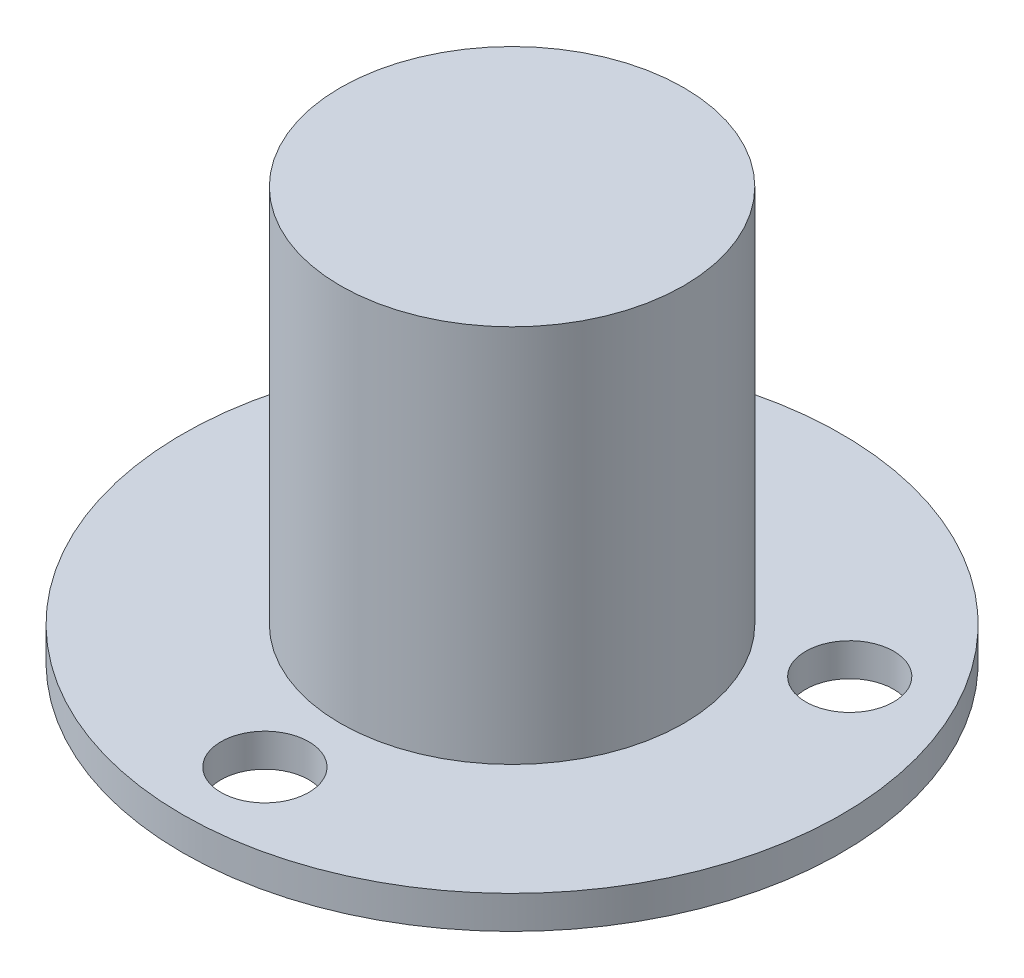
ISO-10303-21;
HEADER;
FILE_DESCRIPTION(('STEP AP214'),'2;1');
FILE_NAME('part.step','',(''),(''),'','','');
FILE_SCHEMA(('AUTOMOTIVE_DESIGN { 1 0 10303 214 1 1 1 1 }'));
ENDSEC;
DATA;
#1=APPLICATION_CONTEXT('core data for automotive mechanical design processes');
#2=APPLICATION_PROTOCOL_DEFINITION('international standard','automotive_design',2000,#1);
#3=PRODUCT_CONTEXT('',#1,'mechanical');
#4=PRODUCT('Part','Part','',(#3));
#5=PRODUCT_RELATED_PRODUCT_CATEGORY('part','',(#4));
#6=PRODUCT_DEFINITION_FORMATION('','',#4);
#7=PRODUCT_DEFINITION_CONTEXT('part definition',#1,'design');
#8=PRODUCT_DEFINITION('design','',#6,#7);
#9=PRODUCT_DEFINITION_SHAPE('','',#8);
#10=(LENGTH_UNIT() NAMED_UNIT(*) SI_UNIT(.MILLI.,.METRE.));
#11=(NAMED_UNIT(*) PLANE_ANGLE_UNIT() SI_UNIT($,.RADIAN.));
#12=(NAMED_UNIT(*) SI_UNIT($,.STERADIAN.) SOLID_ANGLE_UNIT());
#13=UNCERTAINTY_MEASURE_WITH_UNIT(LENGTH_MEASURE(1.E-05),#10,'distance_accuracy_value','');
#14=(GEOMETRIC_REPRESENTATION_CONTEXT(3) GLOBAL_UNCERTAINTY_ASSIGNED_CONTEXT((#13)) GLOBAL_UNIT_ASSIGNED_CONTEXT((#10,
#11,#12)) REPRESENTATION_CONTEXT('',''));
#15=CARTESIAN_POINT('',(0.,0.,0.));
#16=DIRECTION('',(0.,0.,1.));
#17=DIRECTION('',(1.,0.,0.));
#18=AXIS2_PLACEMENT_3D('',#15,#16,#17);
#19=CARTESIAN_POINT('',(0.,1.2,0.));
#20=DIRECTION('',(0.,-1.,0.));
#21=DIRECTION('',(0.,0.,-1.));
#22=AXIS2_PLACEMENT_3D('',#19,#20,#21);
#23=CYLINDRICAL_SURFACE('',#22,12.);
#24=CARTESIAN_POINT('',(0.,1.2,0.));
#25=DIRECTION('',(0.,1.,0.));
#26=DIRECTION('',(0.,0.,1.));
#27=AXIS2_PLACEMENT_3D('',#24,#25,#26);
#28=CIRCLE('',#27,12.);
#29=CARTESIAN_POINT('',(0.,1.2,12.));
#30=VERTEX_POINT('',#29);
#31=EDGE_CURVE('E63',#30,#30,#28,.T.);
#32=ORIENTED_EDGE('',*,*,#31,.F.);
#33=EDGE_LOOP('',(#32));
#34=FACE_BOUND('',#33,.T.);
#35=CARTESIAN_POINT('',(0.,0.,0.));
#36=DIRECTION('',(0.,1.,0.));
#37=DIRECTION('',(0.,0.,1.));
#38=AXIS2_PLACEMENT_3D('',#35,#36,#37);
#39=CIRCLE('',#38,12.);
#40=CARTESIAN_POINT('',(0.,0.,12.));
#41=VERTEX_POINT('',#40);
#42=EDGE_CURVE('E52',#41,#41,#39,.T.);
#43=ORIENTED_EDGE('',*,*,#42,.T.);
#44=EDGE_LOOP('',(#43));
#45=FACE_BOUND('',#44,.T.);
#46=ADVANCED_FACE('F49',(#34,#45),#23,.T.);
#47=CARTESIAN_POINT('',(0.,1.2,0.));
#48=DIRECTION('',(0.,1.,0.));
#49=DIRECTION('',(0.,0.,1.));
#50=AXIS2_PLACEMENT_3D('',#47,#48,#49);
#51=PLANE('',#50);
#52=CARTESIAN_POINT('',(0.,1.2,9.));
#53=DIRECTION('',(0.,1.,0.));
#54=DIRECTION('',(0.,0.,1.));
#55=AXIS2_PLACEMENT_3D('',#52,#53,#54);
#56=CIRCLE('',#55,1.6);
#57=CARTESIAN_POINT('',(0.,1.2,7.4));
#58=VERTEX_POINT('',#57);
#59=EDGE_CURVE('E184',#58,#58,#56,.F.);
#60=ORIENTED_EDGE('',*,*,#59,.T.);
#61=EDGE_LOOP('',(#60));
#62=FACE_BOUND('',#61,.T.);
#63=CARTESIAN_POINT('',(7.79422863406033,1.2,-4.49999999999978));
#64=DIRECTION('',(0.,1.,0.));
#65=DIRECTION('',(0.,0.,1.));
#66=AXIS2_PLACEMENT_3D('',#63,#64,#65);
#67=CIRCLE('',#66,1.60000000000034);
#68=CARTESIAN_POINT('',(7.79422863406033,1.2,-6.10000000000012));
#69=VERTEX_POINT('',#68);
#70=EDGE_CURVE('E193',#69,#69,#67,.F.);
#71=ORIENTED_EDGE('',*,*,#70,.T.);
#72=EDGE_LOOP('',(#71));
#73=FACE_BOUND('',#72,.T.);
#74=CARTESIAN_POINT('',(-7.79422863405956,1.2,-4.50000000000022));
#75=DIRECTION('',(0.,1.,0.));
#76=DIRECTION('',(0.,0.,1.));
#77=AXIS2_PLACEMENT_3D('',#74,#75,#76);
#78=CIRCLE('',#77,1.60000000000051);
#79=CARTESIAN_POINT('',(-7.79422863405956,1.2,-6.10000000000074));
#80=VERTEX_POINT('',#79);
#81=EDGE_CURVE('E201',#80,#80,#78,.F.);
#82=ORIENTED_EDGE('',*,*,#81,.T.);
#83=EDGE_LOOP('',(#82));
#84=FACE_BOUND('',#83,.T.);
#85=CARTESIAN_POINT('',(0.,1.2,0.));
#86=DIRECTION('',(0.,1.,0.));
#87=DIRECTION('',(0.,0.,1.));
#88=AXIS2_PLACEMENT_3D('',#85,#86,#87);
#89=CIRCLE('',#88,6.25);
#90=CARTESIAN_POINT('',(0.,1.2,-6.25));
#91=VERTEX_POINT('',#90);
#92=EDGE_CURVE('E57',#91,#91,#89,.T.);
#93=ORIENTED_EDGE('',*,*,#92,.F.);
#94=EDGE_LOOP('',(#93));
#95=FACE_BOUND('',#94,.T.);
#96=ORIENTED_EDGE('',*,*,#31,.T.);
#97=EDGE_LOOP('',(#96));
#98=FACE_BOUND('',#97,.T.);
#99=ADVANCED_FACE('F84',(#62,#73,#84,#95,#98),#51,.T.);
#100=CARTESIAN_POINT('',(0.,0.,0.));
#101=DIRECTION('',(0.,1.,0.));
#102=DIRECTION('',(0.,0.,1.));
#103=AXIS2_PLACEMENT_3D('',#100,#101,#102);
#104=PLANE('',#103);
#105=CARTESIAN_POINT('',(0.,0.,9.));
#106=DIRECTION('',(0.,-1.,0.));
#107=DIRECTION('',(0.,0.,-1.));
#108=AXIS2_PLACEMENT_3D('',#105,#106,#107);
#109=CIRCLE('',#108,1.6);
#110=CARTESIAN_POINT('',(0.,0.,7.4));
#111=VERTEX_POINT('',#110);
#112=EDGE_CURVE('E181',#111,#111,#109,.T.);
#113=ORIENTED_EDGE('',*,*,#112,.F.);
#114=EDGE_LOOP('',(#113));
#115=FACE_BOUND('',#114,.T.);
#116=CARTESIAN_POINT('',(7.79422863406033,0.,-4.49999999999978));
#117=DIRECTION('',(0.,-1.,0.));
#118=DIRECTION('',(0.,0.,-1.));
#119=AXIS2_PLACEMENT_3D('',#116,#117,#118);
#120=CIRCLE('',#119,1.60000000000034);
#121=CARTESIAN_POINT('',(7.79422863406033,0.,-6.10000000000012));
#122=VERTEX_POINT('',#121);
#123=EDGE_CURVE('E190',#122,#122,#120,.T.);
#124=ORIENTED_EDGE('',*,*,#123,.F.);
#125=EDGE_LOOP('',(#124));
#126=FACE_BOUND('',#125,.T.);
#127=CARTESIAN_POINT('',(-7.79422863405956,0.,-4.50000000000022));
#128=DIRECTION('',(0.,-1.,0.));
#129=DIRECTION('',(0.,0.,-1.));
#130=AXIS2_PLACEMENT_3D('',#127,#128,#129);
#131=CIRCLE('',#130,1.60000000000051);
#132=CARTESIAN_POINT('',(-7.79422863405956,0.,-6.10000000000074));
#133=VERTEX_POINT('',#132);
#134=EDGE_CURVE('E197',#133,#133,#131,.T.);
#135=ORIENTED_EDGE('',*,*,#134,.F.);
#136=EDGE_LOOP('',(#135));
#137=FACE_BOUND('',#136,.T.);
#138=CARTESIAN_POINT('',(0.,0.,0.));
#139=DIRECTION('',(0.,-1.,0.));
#140=DIRECTION('',(0.,0.,-1.));
#141=AXIS2_PLACEMENT_3D('',#138,#139,#140);
#142=CIRCLE('',#141,2.5);
#143=CARTESIAN_POINT('',(0.,0.,-2.5));
#144=VERTEX_POINT('',#143);
#145=EDGE_CURVE('E10',#144,#144,#142,.T.);
#146=ORIENTED_EDGE('',*,*,#145,.F.);
#147=EDGE_LOOP('',(#146));
#148=FACE_BOUND('',#147,.T.);
#149=ORIENTED_EDGE('',*,*,#42,.F.);
#150=EDGE_LOOP('',(#149));
#151=FACE_BOUND('',#150,.T.);
#152=ADVANCED_FACE('F81',(#115,#126,#137,#148,#151),#104,.F.);
#153=CARTESIAN_POINT('',(0.,15.,0.));
#154=DIRECTION('',(0.,-1.,0.));
#155=DIRECTION('',(0.,0.,-1.));
#156=AXIS2_PLACEMENT_3D('',#153,#154,#155);
#157=CYLINDRICAL_SURFACE('',#156,6.25);
#158=CARTESIAN_POINT('',(0.,15.,0.));
#159=DIRECTION('',(0.,1.,0.));
#160=DIRECTION('',(0.,0.,1.));
#161=AXIS2_PLACEMENT_3D('',#158,#159,#160);
#162=CIRCLE('',#161,6.25);
#163=CARTESIAN_POINT('',(0.,15.,-6.25));
#164=VERTEX_POINT('',#163);
#165=EDGE_CURVE('E69',#164,#164,#162,.T.);
#166=CARTESIAN_POINT('',(0.,15.,-6.25));
#167=CARTESIAN_POINT('',(0.,14.85625,-6.25));
#168=CARTESIAN_POINT('',(0.,14.7125,-6.25));
#169=CARTESIAN_POINT('',(0.,14.425,-6.25));
#170=CARTESIAN_POINT('',(0.,14.28125,-6.25));
#171=CARTESIAN_POINT('',(0.,13.99375,-6.25));
#172=CARTESIAN_POINT('',(0.,13.85,-6.25));
#173=CARTESIAN_POINT('',(0.,13.5625,-6.25));
#174=CARTESIAN_POINT('',(0.,13.41875,-6.25));
#175=CARTESIAN_POINT('',(0.,13.13125,-6.25));
#176=CARTESIAN_POINT('',(0.,12.9875,-6.25));
#177=CARTESIAN_POINT('',(0.,12.7,-6.25));
#178=CARTESIAN_POINT('',(0.,12.55625,-6.25));
#179=CARTESIAN_POINT('',(0.,12.26875,-6.25));
#180=CARTESIAN_POINT('',(0.,12.125,-6.25));
#181=CARTESIAN_POINT('',(0.,11.8375,-6.25));
#182=CARTESIAN_POINT('',(0.,11.69375,-6.25));
#183=CARTESIAN_POINT('',(0.,11.40625,-6.25));
#184=CARTESIAN_POINT('',(0.,11.2625,-6.25));
#185=CARTESIAN_POINT('',(0.,10.975,-6.25));
#186=CARTESIAN_POINT('',(0.,10.83125,-6.25));
#187=CARTESIAN_POINT('',(0.,10.54375,-6.25));
#188=CARTESIAN_POINT('',(0.,10.4,-6.25));
#189=CARTESIAN_POINT('',(0.,10.1125,-6.25));
#190=CARTESIAN_POINT('',(0.,9.96875,-6.25));
#191=CARTESIAN_POINT('',(0.,9.68125,-6.25));
#192=CARTESIAN_POINT('',(0.,9.5375,-6.25));
#193=CARTESIAN_POINT('',(0.,9.25,-6.25));
#194=CARTESIAN_POINT('',(0.,9.10625,-6.25));
#195=CARTESIAN_POINT('',(0.,8.81875,-6.25));
#196=CARTESIAN_POINT('',(0.,8.675,-6.25));
#197=CARTESIAN_POINT('',(0.,8.3875,-6.25));
#198=CARTESIAN_POINT('',(0.,8.24375,-6.25));
#199=CARTESIAN_POINT('',(0.,7.95625,-6.25));
#200=CARTESIAN_POINT('',(0.,7.8125,-6.25));
#201=CARTESIAN_POINT('',(0.,7.525,-6.25));
#202=CARTESIAN_POINT('',(0.,7.38125,-6.25));
#203=CARTESIAN_POINT('',(0.,7.09375,-6.25));
#204=CARTESIAN_POINT('',(0.,6.95,-6.25));
#205=CARTESIAN_POINT('',(0.,6.6625,-6.25));
#206=CARTESIAN_POINT('',(0.,6.51875,-6.25));
#207=CARTESIAN_POINT('',(0.,6.23125,-6.25));
#208=CARTESIAN_POINT('',(0.,6.0875,-6.25));
#209=CARTESIAN_POINT('',(0.,5.8,-6.25));
#210=CARTESIAN_POINT('',(0.,5.65625,-6.25));
#211=CARTESIAN_POINT('',(0.,5.36875,-6.25));
#212=CARTESIAN_POINT('',(0.,5.225,-6.25));
#213=CARTESIAN_POINT('',(0.,4.9375,-6.25));
#214=CARTESIAN_POINT('',(0.,4.79375,-6.25));
#215=CARTESIAN_POINT('',(0.,4.50625,-6.25));
#216=CARTESIAN_POINT('',(0.,4.3625,-6.25));
#217=CARTESIAN_POINT('',(0.,4.075,-6.25));
#218=CARTESIAN_POINT('',(0.,3.93125,-6.25));
#219=CARTESIAN_POINT('',(0.,3.64375,-6.25));
#220=CARTESIAN_POINT('',(0.,3.5,-6.25));
#221=CARTESIAN_POINT('',(0.,3.2125,-6.25));
#222=CARTESIAN_POINT('',(0.,3.06875,-6.25));
#223=CARTESIAN_POINT('',(0.,2.78125,-6.25));
#224=CARTESIAN_POINT('',(0.,2.6375,-6.25));
#225=CARTESIAN_POINT('',(0.,2.35,-6.25));
#226=CARTESIAN_POINT('',(0.,2.20625,-6.25));
#227=CARTESIAN_POINT('',(0.,1.91875,-6.25));
#228=CARTESIAN_POINT('',(0.,1.775,-6.25));
#229=CARTESIAN_POINT('',(0.,1.4875,-6.25));
#230=CARTESIAN_POINT('',(0.,1.34375,-6.25));
#231=CARTESIAN_POINT('',(0.,1.2,-6.25));
#232=B_SPLINE_CURVE_WITH_KNOTS('',3,(#166,#167,#168,#169,#170,#171,#172,#173,#174,#175,#176,
#177,#178,#179,#180,#181,#182,#183,#184,#185,#186,#187,#188,#189,#190,#191,#192,#193,#194,#195,
#196,#197,#198,#199,#200,#201,#202,#203,#204,#205,#206,#207,#208,#209,#210,#211,#212,#213,#214,
#215,#216,#217,#218,#219,#220,#221,#222,#223,#224,#225,#226,#227,#228,#229,#230,#231),
.UNSPECIFIED.,.F.,.F.,(4,2,2,2,2,2,2,2,2,2,2,2,2,2,2,2,2,2,2,2,2,2,2,2,2,2,2,2,2,2,2,2,4),(0.,
0.431250000000001,0.8625,1.29375,1.725,2.15625,2.5875,3.01875,3.45,3.88125,4.3125,4.74375,5.175,
5.60625,6.0375,6.46875,6.9,7.33125,7.7625,8.19375,8.625,9.05625,9.4875,9.91875,10.35,10.78125,
11.2125,11.64375,12.075,12.50625,12.9375,13.36875,13.8),.UNSPECIFIED.);
#233=EDGE_CURVE('BSEAM83',#164,#91,#232,.T.);
#234=ORIENTED_EDGE('',*,*,#165,.F.);
#235=ORIENTED_EDGE('',*,*,#92,.T.);
#236=ORIENTED_EDGE('',*,*,#233,.T.);
#237=ORIENTED_EDGE('',*,*,#233,.F.);
#238=EDGE_LOOP('',(#234,#236,#235,#237));
#239=FACE_BOUND('',#238,.T.);
#240=ADVANCED_FACE('F83',(#239),#157,.T.);
#241=CARTESIAN_POINT('',(0.,15.,0.));
#242=DIRECTION('',(0.,1.,0.));
#243=DIRECTION('',(0.,0.,1.));
#244=AXIS2_PLACEMENT_3D('',#241,#242,#243);
#245=PLANE('',#244);
#246=ORIENTED_EDGE('',*,*,#165,.T.);
#247=EDGE_LOOP('',(#246));
#248=FACE_BOUND('',#247,.T.);
#249=ADVANCED_FACE('F91',(#248),#245,.T.);
#250=CARTESIAN_POINT('',(0.,-1.5,0.));
#251=DIRECTION('',(0.,1.,0.));
#252=DIRECTION('',(0.,0.,1.));
#253=AXIS2_PLACEMENT_3D('',#250,#251,#252);
#254=CYLINDRICAL_SURFACE('',#253,2.5);
#255=CARTESIAN_POINT('',(0.,-1.5,0.));
#256=DIRECTION('',(0.,-1.,0.));
#257=DIRECTION('',(0.,0.,-1.));
#258=AXIS2_PLACEMENT_3D('',#255,#256,#257);
#259=CIRCLE('',#258,2.5);
#260=CARTESIAN_POINT('',(0.,-1.5,-2.5));
#261=VERTEX_POINT('',#260);
#262=EDGE_CURVE('E67',#261,#261,#259,.T.);
#263=ORIENTED_EDGE('',*,*,#262,.F.);
#264=EDGE_LOOP('',(#263));
#265=FACE_BOUND('',#264,.T.);
#266=ORIENTED_EDGE('',*,*,#145,.T.);
#267=EDGE_LOOP('',(#266));
#268=FACE_BOUND('',#267,.T.);
#269=ADVANCED_FACE('F115',(#265,#268),#254,.T.);
#270=CARTESIAN_POINT('',(0.,-1.5,0.));
#271=DIRECTION('',(0.,-1.,0.));
#272=DIRECTION('',(0.,0.,-1.));
#273=AXIS2_PLACEMENT_3D('',#270,#271,#272);
#274=PLANE('',#273);
#275=ORIENTED_EDGE('',*,*,#262,.T.);
#276=EDGE_LOOP('',(#275));
#277=FACE_BOUND('',#276,.T.);
#278=ADVANCED_FACE('F124',(#277),#274,.T.);
#279=CARTESIAN_POINT('',(-7.79422863405956,5.72548339959535,-4.50000000000022));
#280=DIRECTION('',(0.,-1.,0.));
#281=DIRECTION('',(0.,0.,-1.));
#282=AXIS2_PLACEMENT_3D('',#279,#280,#281);
#283=CYLINDRICAL_SURFACE('',#282,1.60000000000051);
#284=CARTESIAN_POINT('',(-7.79422863405956,0.,-6.10000000000074));
#285=CARTESIAN_POINT('',(-7.79422863405956,0.0125000000000009,-6.10000000000074));
#286=CARTESIAN_POINT('',(-7.79422863405956,0.025000000000001,-6.10000000000074));
#287=CARTESIAN_POINT('',(-7.79422863405956,0.0500000000000008,-6.10000000000074));
#288=CARTESIAN_POINT('',(-7.79422863405956,0.0625000000000006,-6.10000000000074));
#289=CARTESIAN_POINT('',(-7.79422863405956,0.0875000000000005,-6.10000000000074));
#290=CARTESIAN_POINT('',(-7.79422863405956,0.100000000000001,-6.10000000000074));
#291=CARTESIAN_POINT('',(-7.79422863405956,0.125000000000001,-6.10000000000074));
#292=CARTESIAN_POINT('',(-7.79422863405956,0.137500000000001,-6.10000000000074));
#293=CARTESIAN_POINT('',(-7.79422863405956,0.162500000000001,-6.10000000000074));
#294=CARTESIAN_POINT('',(-7.79422863405956,0.175,-6.10000000000074));
#295=CARTESIAN_POINT('',(-7.79422863405956,0.2,-6.10000000000074));
#296=CARTESIAN_POINT('',(-7.79422863405956,0.2125,-6.10000000000074));
#297=CARTESIAN_POINT('',(-7.79422863405956,0.2375,-6.10000000000074));
#298=CARTESIAN_POINT('',(-7.79422863405956,0.25,-6.10000000000074));
#299=CARTESIAN_POINT('',(-7.79422863405956,0.275000000000001,-6.10000000000074));
#300=CARTESIAN_POINT('',(-7.79422863405956,0.287500000000001,-6.10000000000074));
#301=CARTESIAN_POINT('',(-7.79422863405956,0.312500000000001,-6.10000000000074));
#302=CARTESIAN_POINT('',(-7.79422863405956,0.325,-6.10000000000074));
#303=CARTESIAN_POINT('',(-7.79422863405956,0.35,-6.10000000000074));
#304=CARTESIAN_POINT('',(-7.79422863405956,0.3625,-6.10000000000074));
#305=CARTESIAN_POINT('',(-7.79422863405956,0.3875,-6.10000000000074));
#306=CARTESIAN_POINT('',(-7.79422863405956,0.4,-6.10000000000074));
#307=CARTESIAN_POINT('',(-7.79422863405956,0.425,-6.10000000000074));
#308=CARTESIAN_POINT('',(-7.79422863405956,0.4375,-6.10000000000074));
#309=CARTESIAN_POINT('',(-7.79422863405956,0.4625,-6.10000000000074));
#310=CARTESIAN_POINT('',(-7.79422863405956,0.475,-6.10000000000074));
#311=CARTESIAN_POINT('',(-7.79422863405956,0.5,-6.10000000000074));
#312=CARTESIAN_POINT('',(-7.79422863405956,0.5125,-6.10000000000074));
#313=CARTESIAN_POINT('',(-7.79422863405956,0.5375,-6.10000000000074));
#314=CARTESIAN_POINT('',(-7.79422863405956,0.55,-6.10000000000074));
#315=CARTESIAN_POINT('',(-7.79422863405956,0.575,-6.10000000000074));
#316=CARTESIAN_POINT('',(-7.79422863405956,0.5875,-6.10000000000074));
#317=CARTESIAN_POINT('',(-7.79422863405956,0.6125,-6.10000000000074));
#318=CARTESIAN_POINT('',(-7.79422863405956,0.625,-6.10000000000074));
#319=CARTESIAN_POINT('',(-7.79422863405956,0.65,-6.10000000000074));
#320=CARTESIAN_POINT('',(-7.79422863405956,0.6625,-6.10000000000074));
#321=CARTESIAN_POINT('',(-7.79422863405956,0.687499999999999,-6.10000000000074));
#322=CARTESIAN_POINT('',(-7.79422863405956,0.7,-6.10000000000074));
#323=CARTESIAN_POINT('',(-7.79422863405956,0.725,-6.10000000000074));
#324=CARTESIAN_POINT('',(-7.79422863405956,0.7375,-6.10000000000074));
#325=CARTESIAN_POINT('',(-7.79422863405956,0.7625,-6.10000000000074));
#326=CARTESIAN_POINT('',(-7.79422863405956,0.774999999999999,-6.10000000000074));
#327=CARTESIAN_POINT('',(-7.79422863405956,0.799999999999999,-6.10000000000074));
#328=CARTESIAN_POINT('',(-7.79422863405956,0.812499999999999,-6.10000000000074));
#329=CARTESIAN_POINT('',(-7.79422863405956,0.837499999999999,-6.10000000000074));
#330=CARTESIAN_POINT('',(-7.79422863405956,0.85,-6.10000000000074));
#331=CARTESIAN_POINT('',(-7.79422863405956,0.874999999999999,-6.10000000000074));
#332=CARTESIAN_POINT('',(-7.79422863405956,0.887499999999999,-6.10000000000074));
#333=CARTESIAN_POINT('',(-7.79422863405956,0.912499999999999,-6.10000000000074));
#334=CARTESIAN_POINT('',(-7.79422863405956,0.924999999999999,-6.10000000000074));
#335=CARTESIAN_POINT('',(-7.79422863405956,0.949999999999999,-6.10000000000074));
#336=CARTESIAN_POINT('',(-7.79422863405956,0.962499999999999,-6.10000000000074));
#337=CARTESIAN_POINT('',(-7.79422863405956,0.987499999999999,-6.10000000000074));
#338=CARTESIAN_POINT('',(-7.79422863405956,0.999999999999999,-6.10000000000074));
#339=CARTESIAN_POINT('',(-7.79422863405956,1.025,-6.10000000000074));
#340=CARTESIAN_POINT('',(-7.79422863405956,1.0375,-6.10000000000074));
#341=CARTESIAN_POINT('',(-7.79422863405956,1.0625,-6.10000000000074));
#342=CARTESIAN_POINT('',(-7.79422863405956,1.075,-6.10000000000074));
#343=CARTESIAN_POINT('',(-7.79422863405956,1.1,-6.10000000000074));
#344=CARTESIAN_POINT('',(-7.79422863405956,1.1125,-6.10000000000074));
#345=CARTESIAN_POINT('',(-7.79422863405956,1.1375,-6.10000000000074));
#346=CARTESIAN_POINT('',(-7.79422863405956,1.15,-6.10000000000074));
#347=CARTESIAN_POINT('',(-7.79422863405956,1.175,-6.10000000000074));
#348=CARTESIAN_POINT('',(-7.79422863405956,1.1875,-6.10000000000074));
#349=CARTESIAN_POINT('',(-7.79422863405956,1.2,-6.10000000000074));
#350=B_SPLINE_CURVE_WITH_KNOTS('',3,(#284,#285,#286,#287,#288,#289,#290,#291,#292,#293,#294,
#295,#296,#297,#298,#299,#300,#301,#302,#303,#304,#305,#306,#307,#308,#309,#310,#311,#312,#313,
#314,#315,#316,#317,#318,#319,#320,#321,#322,#323,#324,#325,#326,#327,#328,#329,#330,#331,#332,
#333,#334,#335,#336,#337,#338,#339,#340,#341,#342,#343,#344,#345,#346,#347,#348,#349),
.UNSPECIFIED.,.F.,.F.,(4,2,2,2,2,2,2,2,2,2,2,2,2,2,2,2,2,2,2,2,2,2,2,2,2,2,2,2,2,2,2,2,4),(0.,
0.0375000000000002,0.0749999999999995,0.1125,0.15,0.187499999999999,0.225,0.2625,0.3,
0.337499999999999,0.374999999999999,0.4125,0.449999999999999,0.487499999999999,
0.524999999999999,0.562499999999999,0.599999999999999,0.637499999999999,0.674999999999998,
0.712499999999999,0.749999999999999,0.787499999999998,0.824999999999999,0.862499999999999,
0.899999999999998,0.937499999999998,0.974999999999998,1.0125,1.05,1.0875,1.125,1.1625,1.2),.UNSPECIFIED.);
#351=EDGE_CURVE('BSEAM132',#133,#80,#350,.T.);
#352=ORIENTED_EDGE('',*,*,#134,.T.);
#353=ORIENTED_EDGE('',*,*,#81,.F.);
#354=ORIENTED_EDGE('',*,*,#351,.T.);
#355=ORIENTED_EDGE('',*,*,#351,.F.);
#356=EDGE_LOOP('',(#352,#354,#353,#355));
#357=FACE_BOUND('',#356,.T.);
#358=ADVANCED_FACE('F132',(#357),#283,.F.);
#359=CARTESIAN_POINT('',(7.79422863406033,5.72548339959535,-4.49999999999978));
#360=DIRECTION('',(0.,-1.,0.));
#361=DIRECTION('',(0.,0.,-1.));
#362=AXIS2_PLACEMENT_3D('',#359,#360,#361);
#363=CYLINDRICAL_SURFACE('',#362,1.60000000000034);
#364=CARTESIAN_POINT('',(7.79422863406033,0.,-6.10000000000012));
#365=CARTESIAN_POINT('',(7.79422863406033,0.0125000000000009,-6.10000000000012));
#366=CARTESIAN_POINT('',(7.79422863406033,0.025000000000001,-6.10000000000012));
#367=CARTESIAN_POINT('',(7.79422863406033,0.0500000000000008,-6.10000000000012));
#368=CARTESIAN_POINT('',(7.79422863406033,0.0625000000000006,-6.10000000000012));
#369=CARTESIAN_POINT('',(7.79422863406033,0.0875000000000005,-6.10000000000012));
#370=CARTESIAN_POINT('',(7.79422863406033,0.100000000000001,-6.10000000000012));
#371=CARTESIAN_POINT('',(7.79422863406033,0.125000000000001,-6.10000000000012));
#372=CARTESIAN_POINT('',(7.79422863406033,0.137500000000001,-6.10000000000012));
#373=CARTESIAN_POINT('',(7.79422863406033,0.162500000000001,-6.10000000000012));
#374=CARTESIAN_POINT('',(7.79422863406033,0.175,-6.10000000000012));
#375=CARTESIAN_POINT('',(7.79422863406033,0.2,-6.10000000000012));
#376=CARTESIAN_POINT('',(7.79422863406033,0.2125,-6.10000000000012));
#377=CARTESIAN_POINT('',(7.79422863406033,0.2375,-6.10000000000012));
#378=CARTESIAN_POINT('',(7.79422863406033,0.25,-6.10000000000012));
#379=CARTESIAN_POINT('',(7.79422863406033,0.275000000000001,-6.10000000000012));
#380=CARTESIAN_POINT('',(7.79422863406033,0.287500000000001,-6.10000000000012));
#381=CARTESIAN_POINT('',(7.79422863406033,0.312500000000001,-6.10000000000012));
#382=CARTESIAN_POINT('',(7.79422863406033,0.325,-6.10000000000012));
#383=CARTESIAN_POINT('',(7.79422863406033,0.35,-6.10000000000012));
#384=CARTESIAN_POINT('',(7.79422863406033,0.3625,-6.10000000000012));
#385=CARTESIAN_POINT('',(7.79422863406033,0.3875,-6.10000000000012));
#386=CARTESIAN_POINT('',(7.79422863406033,0.4,-6.10000000000012));
#387=CARTESIAN_POINT('',(7.79422863406033,0.425,-6.10000000000012));
#388=CARTESIAN_POINT('',(7.79422863406033,0.4375,-6.10000000000012));
#389=CARTESIAN_POINT('',(7.79422863406033,0.4625,-6.10000000000012));
#390=CARTESIAN_POINT('',(7.79422863406033,0.475,-6.10000000000012));
#391=CARTESIAN_POINT('',(7.79422863406033,0.5,-6.10000000000012));
#392=CARTESIAN_POINT('',(7.79422863406033,0.5125,-6.10000000000012));
#393=CARTESIAN_POINT('',(7.79422863406033,0.5375,-6.10000000000012));
#394=CARTESIAN_POINT('',(7.79422863406033,0.55,-6.10000000000012));
#395=CARTESIAN_POINT('',(7.79422863406033,0.575,-6.10000000000012));
#396=CARTESIAN_POINT('',(7.79422863406033,0.5875,-6.10000000000012));
#397=CARTESIAN_POINT('',(7.79422863406033,0.6125,-6.10000000000012));
#398=CARTESIAN_POINT('',(7.79422863406033,0.625,-6.10000000000012));
#399=CARTESIAN_POINT('',(7.79422863406033,0.65,-6.10000000000012));
#400=CARTESIAN_POINT('',(7.79422863406033,0.6625,-6.10000000000012));
#401=CARTESIAN_POINT('',(7.79422863406033,0.687499999999999,-6.10000000000012));
#402=CARTESIAN_POINT('',(7.79422863406033,0.7,-6.10000000000012));
#403=CARTESIAN_POINT('',(7.79422863406033,0.725,-6.10000000000012));
#404=CARTESIAN_POINT('',(7.79422863406033,0.7375,-6.10000000000012));
#405=CARTESIAN_POINT('',(7.79422863406033,0.7625,-6.10000000000012));
#406=CARTESIAN_POINT('',(7.79422863406033,0.774999999999999,-6.10000000000012));
#407=CARTESIAN_POINT('',(7.79422863406033,0.799999999999999,-6.10000000000012));
#408=CARTESIAN_POINT('',(7.79422863406033,0.812499999999999,-6.10000000000012));
#409=CARTESIAN_POINT('',(7.79422863406033,0.837499999999999,-6.10000000000012));
#410=CARTESIAN_POINT('',(7.79422863406033,0.85,-6.10000000000012));
#411=CARTESIAN_POINT('',(7.79422863406033,0.874999999999999,-6.10000000000012));
#412=CARTESIAN_POINT('',(7.79422863406033,0.887499999999999,-6.10000000000012));
#413=CARTESIAN_POINT('',(7.79422863406033,0.912499999999999,-6.10000000000012));
#414=CARTESIAN_POINT('',(7.79422863406033,0.924999999999999,-6.10000000000012));
#415=CARTESIAN_POINT('',(7.79422863406033,0.949999999999999,-6.10000000000012));
#416=CARTESIAN_POINT('',(7.79422863406033,0.962499999999999,-6.10000000000012));
#417=CARTESIAN_POINT('',(7.79422863406033,0.987499999999999,-6.10000000000012));
#418=CARTESIAN_POINT('',(7.79422863406033,0.999999999999999,-6.10000000000012));
#419=CARTESIAN_POINT('',(7.79422863406033,1.025,-6.10000000000012));
#420=CARTESIAN_POINT('',(7.79422863406033,1.0375,-6.10000000000012));
#421=CARTESIAN_POINT('',(7.79422863406033,1.0625,-6.10000000000012));
#422=CARTESIAN_POINT('',(7.79422863406033,1.075,-6.10000000000012));
#423=CARTESIAN_POINT('',(7.79422863406033,1.1,-6.10000000000012));
#424=CARTESIAN_POINT('',(7.79422863406033,1.1125,-6.10000000000012));
#425=CARTESIAN_POINT('',(7.79422863406033,1.1375,-6.10000000000012));
#426=CARTESIAN_POINT('',(7.79422863406033,1.15,-6.10000000000012));
#427=CARTESIAN_POINT('',(7.79422863406033,1.175,-6.10000000000012));
#428=CARTESIAN_POINT('',(7.79422863406033,1.1875,-6.10000000000012));
#429=CARTESIAN_POINT('',(7.79422863406033,1.2,-6.10000000000012));
#430=B_SPLINE_CURVE_WITH_KNOTS('',3,(#364,#365,#366,#367,#368,#369,#370,#371,#372,#373,#374,
#375,#376,#377,#378,#379,#380,#381,#382,#383,#384,#385,#386,#387,#388,#389,#390,#391,#392,#393,
#394,#395,#396,#397,#398,#399,#400,#401,#402,#403,#404,#405,#406,#407,#408,#409,#410,#411,#412,
#413,#414,#415,#416,#417,#418,#419,#420,#421,#422,#423,#424,#425,#426,#427,#428,#429),
.UNSPECIFIED.,.F.,.F.,(4,2,2,2,2,2,2,2,2,2,2,2,2,2,2,2,2,2,2,2,2,2,2,2,2,2,2,2,2,2,2,2,4),(0.,
0.0375000000000002,0.0749999999999995,0.1125,0.15,0.187499999999999,0.225,0.2625,0.3,
0.337499999999999,0.374999999999999,0.4125,0.449999999999999,0.487499999999999,
0.524999999999999,0.562499999999999,0.599999999999999,0.637499999999999,0.674999999999998,
0.712499999999999,0.749999999999999,0.787499999999998,0.824999999999999,0.862499999999999,
0.899999999999998,0.937499999999998,0.974999999999998,1.0125,1.05,1.0875,1.125,1.1625,1.2),.UNSPECIFIED.);
#431=EDGE_CURVE('BSEAM155',#122,#69,#430,.T.);
#432=ORIENTED_EDGE('',*,*,#123,.T.);
#433=ORIENTED_EDGE('',*,*,#70,.F.);
#434=ORIENTED_EDGE('',*,*,#431,.T.);
#435=ORIENTED_EDGE('',*,*,#431,.F.);
#436=EDGE_LOOP('',(#432,#434,#433,#435));
#437=FACE_BOUND('',#436,.T.);
#438=ADVANCED_FACE('F155',(#437),#363,.F.);
#439=CARTESIAN_POINT('',(0.,5.72548339959535,9.));
#440=DIRECTION('',(0.,-1.,0.));
#441=DIRECTION('',(0.,0.,-1.));
#442=AXIS2_PLACEMENT_3D('',#439,#440,#441);
#443=CYLINDRICAL_SURFACE('',#442,1.6);
#444=CARTESIAN_POINT('',(0.,0.,7.4));
#445=CARTESIAN_POINT('',(0.,0.0125000000000009,7.4));
#446=CARTESIAN_POINT('',(0.,0.025000000000001,7.4));
#447=CARTESIAN_POINT('',(0.,0.0500000000000008,7.4));
#448=CARTESIAN_POINT('',(0.,0.0625000000000006,7.4));
#449=CARTESIAN_POINT('',(0.,0.0875000000000005,7.4));
#450=CARTESIAN_POINT('',(0.,0.100000000000001,7.4));
#451=CARTESIAN_POINT('',(0.,0.125000000000001,7.4));
#452=CARTESIAN_POINT('',(0.,0.137500000000001,7.4));
#453=CARTESIAN_POINT('',(0.,0.162500000000001,7.4));
#454=CARTESIAN_POINT('',(0.,0.175,7.4));
#455=CARTESIAN_POINT('',(0.,0.2,7.4));
#456=CARTESIAN_POINT('',(0.,0.2125,7.4));
#457=CARTESIAN_POINT('',(0.,0.2375,7.4));
#458=CARTESIAN_POINT('',(0.,0.25,7.4));
#459=CARTESIAN_POINT('',(0.,0.275000000000001,7.4));
#460=CARTESIAN_POINT('',(0.,0.287500000000001,7.4));
#461=CARTESIAN_POINT('',(0.,0.312500000000001,7.4));
#462=CARTESIAN_POINT('',(0.,0.325,7.4));
#463=CARTESIAN_POINT('',(0.,0.35,7.4));
#464=CARTESIAN_POINT('',(0.,0.3625,7.4));
#465=CARTESIAN_POINT('',(0.,0.3875,7.4));
#466=CARTESIAN_POINT('',(0.,0.4,7.4));
#467=CARTESIAN_POINT('',(0.,0.425,7.4));
#468=CARTESIAN_POINT('',(0.,0.4375,7.4));
#469=CARTESIAN_POINT('',(0.,0.4625,7.4));
#470=CARTESIAN_POINT('',(0.,0.475,7.4));
#471=CARTESIAN_POINT('',(0.,0.5,7.4));
#472=CARTESIAN_POINT('',(0.,0.5125,7.4));
#473=CARTESIAN_POINT('',(0.,0.5375,7.4));
#474=CARTESIAN_POINT('',(0.,0.55,7.4));
#475=CARTESIAN_POINT('',(0.,0.575,7.4));
#476=CARTESIAN_POINT('',(0.,0.5875,7.4));
#477=CARTESIAN_POINT('',(0.,0.6125,7.4));
#478=CARTESIAN_POINT('',(0.,0.625,7.4));
#479=CARTESIAN_POINT('',(0.,0.65,7.4));
#480=CARTESIAN_POINT('',(0.,0.6625,7.4));
#481=CARTESIAN_POINT('',(0.,0.687499999999999,7.4));
#482=CARTESIAN_POINT('',(0.,0.7,7.4));
#483=CARTESIAN_POINT('',(0.,0.725,7.4));
#484=CARTESIAN_POINT('',(0.,0.7375,7.4));
#485=CARTESIAN_POINT('',(0.,0.7625,7.4));
#486=CARTESIAN_POINT('',(0.,0.774999999999999,7.4));
#487=CARTESIAN_POINT('',(0.,0.799999999999999,7.4));
#488=CARTESIAN_POINT('',(0.,0.812499999999999,7.4));
#489=CARTESIAN_POINT('',(0.,0.837499999999999,7.4));
#490=CARTESIAN_POINT('',(0.,0.85,7.4));
#491=CARTESIAN_POINT('',(0.,0.874999999999999,7.4));
#492=CARTESIAN_POINT('',(0.,0.887499999999999,7.4));
#493=CARTESIAN_POINT('',(0.,0.912499999999999,7.4));
#494=CARTESIAN_POINT('',(0.,0.924999999999999,7.4));
#495=CARTESIAN_POINT('',(0.,0.949999999999999,7.4));
#496=CARTESIAN_POINT('',(0.,0.962499999999999,7.4));
#497=CARTESIAN_POINT('',(0.,0.987499999999999,7.4));
#498=CARTESIAN_POINT('',(0.,0.999999999999999,7.4));
#499=CARTESIAN_POINT('',(0.,1.025,7.4));
#500=CARTESIAN_POINT('',(0.,1.0375,7.4));
#501=CARTESIAN_POINT('',(0.,1.0625,7.4));
#502=CARTESIAN_POINT('',(0.,1.075,7.4));
#503=CARTESIAN_POINT('',(0.,1.1,7.4));
#504=CARTESIAN_POINT('',(0.,1.1125,7.4));
#505=CARTESIAN_POINT('',(0.,1.1375,7.4));
#506=CARTESIAN_POINT('',(0.,1.15,7.4));
#507=CARTESIAN_POINT('',(0.,1.175,7.4));
#508=CARTESIAN_POINT('',(0.,1.1875,7.4));
#509=CARTESIAN_POINT('',(0.,1.2,7.4));
#510=B_SPLINE_CURVE_WITH_KNOTS('',3,(#444,#445,#446,#447,#448,#449,#450,#451,#452,#453,#454,
#455,#456,#457,#458,#459,#460,#461,#462,#463,#464,#465,#466,#467,#468,#469,#470,#471,#472,#473,
#474,#475,#476,#477,#478,#479,#480,#481,#482,#483,#484,#485,#486,#487,#488,#489,#490,#491,#492,
#493,#494,#495,#496,#497,#498,#499,#500,#501,#502,#503,#504,#505,#506,#507,#508,#509),
.UNSPECIFIED.,.F.,.F.,(4,2,2,2,2,2,2,2,2,2,2,2,2,2,2,2,2,2,2,2,2,2,2,2,2,2,2,2,2,2,2,2,4),(0.,
0.0375000000000002,0.0749999999999995,0.1125,0.15,0.187499999999999,0.225,0.2625,0.3,
0.337499999999999,0.374999999999999,0.4125,0.449999999999999,0.487499999999999,
0.524999999999999,0.562499999999999,0.599999999999999,0.637499999999999,0.674999999999998,
0.712499999999999,0.749999999999999,0.787499999999998,0.824999999999999,0.862499999999999,
0.899999999999998,0.937499999999998,0.974999999999998,1.0125,1.05,1.0875,1.125,1.1625,1.2),.UNSPECIFIED.);
#511=EDGE_CURVE('BSEAM164',#111,#58,#510,.T.);
#512=ORIENTED_EDGE('',*,*,#112,.T.);
#513=ORIENTED_EDGE('',*,*,#59,.F.);
#514=ORIENTED_EDGE('',*,*,#511,.T.);
#515=ORIENTED_EDGE('',*,*,#511,.F.);
#516=EDGE_LOOP('',(#512,#514,#513,#515));
#517=FACE_BOUND('',#516,.T.);
#518=ADVANCED_FACE('F164',(#517),#443,.F.);
#519=CLOSED_SHELL('',(#46,#99,#152,#240,#249,#269,#278,#358,#438,#518));
#520=MANIFOLD_SOLID_BREP('B2',#519);
#521=ADVANCED_BREP_SHAPE_REPRESENTATION('',(#18,#520),#14);
#522=SHAPE_DEFINITION_REPRESENTATION(#9,#521);
ENDSEC;
END-ISO-10303-21;
